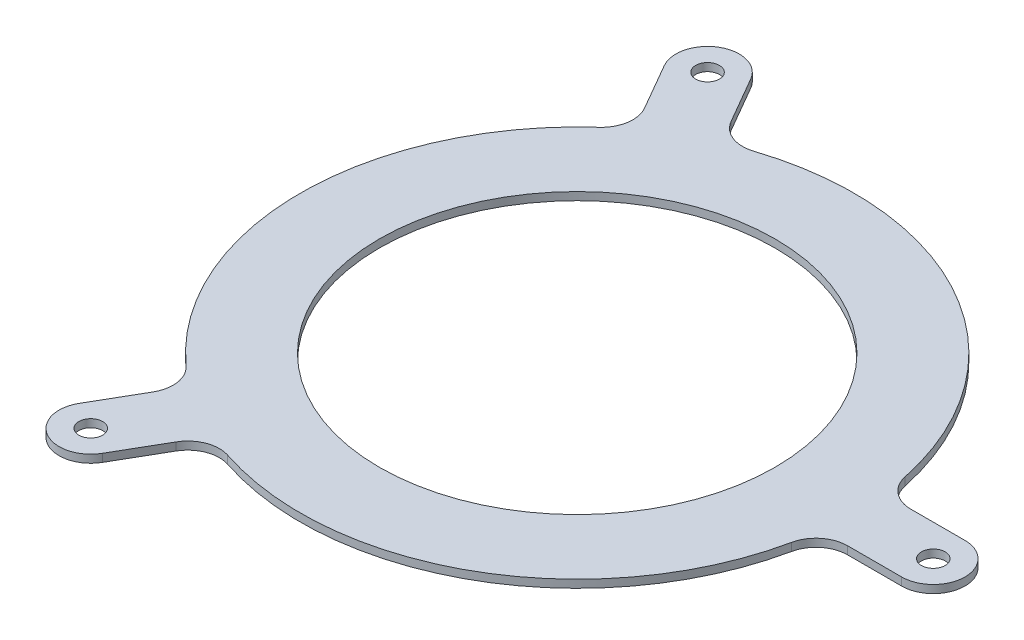
ISO-10303-21;
HEADER;
FILE_DESCRIPTION(('STEP AP214'),'2;1');
FILE_NAME('part.step','',(''),(''),'','','');
FILE_SCHEMA(('AUTOMOTIVE_DESIGN { 1 0 10303 214 1 1 1 1 }'));
ENDSEC;
DATA;
#1=APPLICATION_CONTEXT('core data for automotive mechanical design processes');
#2=APPLICATION_PROTOCOL_DEFINITION('international standard','automotive_design',2000,#1);
#3=PRODUCT_CONTEXT('',#1,'mechanical');
#4=PRODUCT('Part','Part','',(#3));
#5=PRODUCT_RELATED_PRODUCT_CATEGORY('part','',(#4));
#6=PRODUCT_DEFINITION_FORMATION('','',#4);
#7=PRODUCT_DEFINITION_CONTEXT('part definition',#1,'design');
#8=PRODUCT_DEFINITION('design','',#6,#7);
#9=PRODUCT_DEFINITION_SHAPE('','',#8);
#10=(LENGTH_UNIT() NAMED_UNIT(*) SI_UNIT(.MILLI.,.METRE.));
#11=(NAMED_UNIT(*) PLANE_ANGLE_UNIT() SI_UNIT($,.RADIAN.));
#12=(NAMED_UNIT(*) SI_UNIT($,.STERADIAN.) SOLID_ANGLE_UNIT());
#13=UNCERTAINTY_MEASURE_WITH_UNIT(LENGTH_MEASURE(1.E-05),#10,'distance_accuracy_value','');
#14=(GEOMETRIC_REPRESENTATION_CONTEXT(3) GLOBAL_UNCERTAINTY_ASSIGNED_CONTEXT((#13)) GLOBAL_UNIT_ASSIGNED_CONTEXT((#10,
#11,#12)) REPRESENTATION_CONTEXT('',''));
#15=CARTESIAN_POINT('',(0.,0.,0.));
#16=DIRECTION('',(0.,0.,1.));
#17=DIRECTION('',(1.,0.,0.));
#18=AXIS2_PLACEMENT_3D('',#15,#16,#17);
#19=CARTESIAN_POINT('',(0.,1.,0.));
#20=DIRECTION('',(0.,-1.,0.));
#21=DIRECTION('',(0.,0.,-1.));
#22=AXIS2_PLACEMENT_3D('',#19,#20,#21);
#23=CYLINDRICAL_SURFACE('',#22,35.);
#24=CARTESIAN_POINT('',(0.,0.,0.));
#25=DIRECTION('',(0.,1.,0.));
#26=DIRECTION('',(0.,0.,1.));
#27=AXIS2_PLACEMENT_3D('',#24,#25,#26);
#28=CIRCLE('',#27,35.);
#29=CARTESIAN_POINT('',(-10.9102461764105,0.,33.2560750596056));
#30=VERTEX_POINT('',#29);
#31=CARTESIAN_POINT('',(34.2557289199862,0.,7.17948717948719));
#32=VERTEX_POINT('',#31);
#33=EDGE_CURVE('E223',#30,#32,#28,.T.);
#34=ORIENTED_EDGE('',*,*,#33,.T.);
#35=DIRECTION('',(0.,-1.,0.));
#36=VECTOR('',#35,1.);
#37=CARTESIAN_POINT('',(34.2557289199862,1.,7.17948717948719));
#38=LINE('',#37,#36);
#39=CARTESIAN_POINT('',(34.2557289199862,1.,7.17948717948719));
#40=VERTEX_POINT('',#39);
#41=EDGE_CURVE('E290',#32,#40,#38,.F.);
#42=ORIENTED_EDGE('',*,*,#41,.T.);
#43=CARTESIAN_POINT('',(0.,1.,0.));
#44=DIRECTION('',(0.,1.,0.));
#45=DIRECTION('',(0.,0.,1.));
#46=AXIS2_PLACEMENT_3D('',#43,#44,#45);
#47=CIRCLE('',#46,35.);
#48=CARTESIAN_POINT('',(-10.9102461764105,1.,33.2560750596056));
#49=VERTEX_POINT('',#48);
#50=EDGE_CURVE('E182',#49,#40,#47,.T.);
#51=ORIENTED_EDGE('',*,*,#50,.F.);
#52=DIRECTION('',(0.,-1.,0.));
#53=VECTOR('',#52,1.);
#54=CARTESIAN_POINT('',(-10.9102461764105,1.,33.2560750596056));
#55=LINE('',#54,#53);
#56=EDGE_CURVE('E287',#49,#30,#55,.T.);
#57=ORIENTED_EDGE('',*,*,#56,.T.);
#58=EDGE_LOOP('',(#34,#42,#51,#57));
#59=FACE_BOUND('',#58,.T.);
#60=ADVANCED_FACE('F33',(#59),#23,.T.);
#61=CARTESIAN_POINT('',(0.,1.,4.00000000000001));
#62=DIRECTION('',(0.,0.,1.));
#63=DIRECTION('',(1.,0.,0.));
#64=AXIS2_PLACEMENT_3D('',#61,#62,#63);
#65=PLANE('',#64);
#66=DIRECTION('',(-1.,0.,0.));
#67=VECTOR('',#66,1.);
#68=CARTESIAN_POINT('',(0.,1.,4.00000000000001));
#69=LINE('',#68,#67);
#70=CARTESIAN_POINT('',(45.,1.,4.00000000000001));
#71=VERTEX_POINT('',#70);
#72=CARTESIAN_POINT('',(38.1706693679846,1.,4.00000000000001));
#73=VERTEX_POINT('',#72);
#74=EDGE_CURVE('E162',#71,#73,#69,.T.);
#75=ORIENTED_EDGE('',*,*,#74,.T.);
#76=DIRECTION('',(0.,-1.,0.));
#77=VECTOR('',#76,1.);
#78=CARTESIAN_POINT('',(38.1706693679846,1.,4.00000000000001));
#79=LINE('',#78,#77);
#80=CARTESIAN_POINT('',(38.1706693679846,0.,4.00000000000001));
#81=VERTEX_POINT('',#80);
#82=EDGE_CURVE('E285',#73,#81,#79,.T.);
#83=ORIENTED_EDGE('',*,*,#82,.T.);
#84=DIRECTION('',(-1.,0.,0.));
#85=VECTOR('',#84,1.);
#86=CARTESIAN_POINT('',(0.,0.,4.00000000000001));
#87=LINE('',#86,#85);
#88=CARTESIAN_POINT('',(45.,0.,4.00000000000001));
#89=VERTEX_POINT('',#88);
#90=EDGE_CURVE('E165',#89,#81,#87,.T.);
#91=ORIENTED_EDGE('',*,*,#90,.F.);
#92=DIRECTION('',(0.,-1.,0.));
#93=VECTOR('',#92,1.);
#94=CARTESIAN_POINT('',(45.,1.,4.00000000000001));
#95=LINE('',#94,#93);
#96=EDGE_CURVE('E158',#71,#89,#95,.T.);
#97=ORIENTED_EDGE('',*,*,#96,.F.);
#98=EDGE_LOOP('',(#75,#83,#91,#97));
#99=FACE_BOUND('',#98,.T.);
#100=ADVANCED_FACE('F160',(#99),#65,.T.);
#101=CARTESIAN_POINT('',(45.,1.,0.));
#102=DIRECTION('',(0.,-1.,0.));
#103=DIRECTION('',(0.,0.,-1.));
#104=AXIS2_PLACEMENT_3D('',#101,#102,#103);
#105=CYLINDRICAL_SURFACE('',#104,4.00000000000001);
#106=CARTESIAN_POINT('',(45.,0.,0.));
#107=DIRECTION('',(0.,1.,0.));
#108=DIRECTION('',(0.,0.,1.));
#109=AXIS2_PLACEMENT_3D('',#106,#107,#108);
#110=CIRCLE('',#109,4.00000000000001);
#111=CARTESIAN_POINT('',(45.,0.,-4.00000000000001));
#112=VERTEX_POINT('',#111);
#113=EDGE_CURVE('E229',#112,#89,#110,.F.);
#114=ORIENTED_EDGE('',*,*,#113,.F.);
#115=DIRECTION('',(0.,-1.,0.));
#116=VECTOR('',#115,1.);
#117=CARTESIAN_POINT('',(45.,1.,-4.00000000000001));
#118=LINE('',#117,#116);
#119=CARTESIAN_POINT('',(45.,1.,-4.00000000000001));
#120=VERTEX_POINT('',#119);
#121=EDGE_CURVE('E171',#120,#112,#118,.T.);
#122=ORIENTED_EDGE('',*,*,#121,.F.);
#123=CARTESIAN_POINT('',(45.,1.,0.));
#124=DIRECTION('',(0.,1.,0.));
#125=DIRECTION('',(0.,0.,1.));
#126=AXIS2_PLACEMENT_3D('',#123,#124,#125);
#127=CIRCLE('',#126,4.00000000000001);
#128=EDGE_CURVE('E178',#120,#71,#127,.F.);
#129=ORIENTED_EDGE('',*,*,#128,.T.);
#130=ORIENTED_EDGE('',*,*,#96,.T.);
#131=EDGE_LOOP('',(#114,#122,#129,#130));
#132=FACE_BOUND('',#131,.T.);
#133=ADVANCED_FACE('F184',(#132),#105,.T.);
#134=CARTESIAN_POINT('',(0.,1.,-4.00000000000001));
#135=DIRECTION('',(0.,0.,1.));
#136=DIRECTION('',(1.,0.,0.));
#137=AXIS2_PLACEMENT_3D('',#134,#135,#136);
#138=PLANE('',#137);
#139=DIRECTION('',(-1.,0.,0.));
#140=VECTOR('',#139,1.);
#141=CARTESIAN_POINT('',(0.,0.,-4.00000000000001));
#142=LINE('',#141,#140);
#143=CARTESIAN_POINT('',(38.1706693679846,0.,-4.00000000000001));
#144=VERTEX_POINT('',#143);
#145=EDGE_CURVE('E231',#112,#144,#142,.T.);
#146=ORIENTED_EDGE('',*,*,#145,.T.);
#147=DIRECTION('',(0.,1.,0.));
#148=VECTOR('',#147,1.);
#149=CARTESIAN_POINT('',(38.1706693679846,1.,-4.00000000000001));
#150=LINE('',#149,#148);
#151=CARTESIAN_POINT('',(38.1706693679846,1.,-4.00000000000001));
#152=VERTEX_POINT('',#151);
#153=EDGE_CURVE('E283',#144,#152,#150,.T.);
#154=ORIENTED_EDGE('',*,*,#153,.T.);
#155=DIRECTION('',(-1.,0.,0.));
#156=VECTOR('',#155,1.);
#157=CARTESIAN_POINT('',(0.,1.,-4.00000000000001));
#158=LINE('',#157,#156);
#159=EDGE_CURVE('E186',#120,#152,#158,.T.);
#160=ORIENTED_EDGE('',*,*,#159,.F.);
#161=ORIENTED_EDGE('',*,*,#121,.T.);
#162=EDGE_LOOP('',(#146,#154,#160,#161));
#163=FACE_BOUND('',#162,.T.);
#164=ADVANCED_FACE('F377',(#163),#138,.F.);
#165=CARTESIAN_POINT('',(34.2557289199862,0.,-7.17948717948719));
#166=VERTEX_POINT('',#165);
#167=CARTESIAN_POINT('',(-10.9102461764143,0.,-33.2560750596043));
#168=VERTEX_POINT('',#167);
#169=EDGE_CURVE('E226',#166,#168,#28,.T.);
#170=ORIENTED_EDGE('',*,*,#169,.T.);
#171=DIRECTION('',(0.,-1.,0.));
#172=VECTOR('',#171,1.);
#173=CARTESIAN_POINT('',(-10.9102461764143,1.,-33.2560750596043));
#174=LINE('',#173,#172);
#175=CARTESIAN_POINT('',(-10.9102461764143,1.,-33.2560750596043));
#176=VERTEX_POINT('',#175);
#177=EDGE_CURVE('E281',#168,#176,#174,.F.);
#178=ORIENTED_EDGE('',*,*,#177,.T.);
#179=CARTESIAN_POINT('',(34.2557289199862,1.,-7.17948717948719));
#180=VERTEX_POINT('',#179);
#181=EDGE_CURVE('E188',#180,#176,#47,.T.);
#182=ORIENTED_EDGE('',*,*,#181,.F.);
#183=DIRECTION('',(0.,-1.,0.));
#184=VECTOR('',#183,1.);
#185=CARTESIAN_POINT('',(34.2557289199862,1.,-7.17948717948719));
#186=LINE('',#185,#184);
#187=EDGE_CURVE('E278',#180,#166,#186,.T.);
#188=ORIENTED_EDGE('',*,*,#187,.T.);
#189=EDGE_LOOP('',(#170,#178,#182,#188));
#190=FACE_BOUND('',#189,.T.);
#191=ADVANCED_FACE('F337',(#190),#23,.T.);
#192=CARTESIAN_POINT('',(3.46410161513598,1.,-1.99999999999898));
#193=DIRECTION('',(0.866025403784438,0.,-0.500000000000001));
#194=DIRECTION('',(-0.500000000000001,0.,-0.866025403784438));
#195=AXIS2_PLACEMENT_3D('',#192,#193,#194);
#196=PLANE('',#195);
#197=DIRECTION('',(0.500000000000001,0.,0.866025403784438));
#198=VECTOR('',#197,1.);
#199=CARTESIAN_POINT('',(3.46410161513598,1.,-1.99999999999898));
#200=LINE('',#199,#198);
#201=CARTESIAN_POINT('',(-19.0358983848633,1.,-40.9711431702974));
#202=VERTEX_POINT('',#201);
#203=CARTESIAN_POINT('',(-15.6212330688566,1.,-35.0567693521305));
#204=VERTEX_POINT('',#203);
#205=EDGE_CURVE('E192',#202,#204,#200,.T.);
#206=ORIENTED_EDGE('',*,*,#205,.T.);
#207=DIRECTION('',(0.,-1.,0.));
#208=VECTOR('',#207,1.);
#209=CARTESIAN_POINT('',(-15.6212330688566,1.,-35.0567693521305));
#210=LINE('',#209,#208);
#211=CARTESIAN_POINT('',(-15.6212330688566,0.,-35.0567693521305));
#212=VERTEX_POINT('',#211);
#213=EDGE_CURVE('E275',#204,#212,#210,.T.);
#214=ORIENTED_EDGE('',*,*,#213,.T.);
#215=DIRECTION('',(0.500000000000001,0.,0.866025403784438));
#216=VECTOR('',#215,1.);
#217=CARTESIAN_POINT('',(3.46410161513598,0.,-1.99999999999898));
#218=LINE('',#217,#216);
#219=CARTESIAN_POINT('',(-19.0358983848633,0.,-40.9711431702974));
#220=VERTEX_POINT('',#219);
#221=EDGE_CURVE('E234',#220,#212,#218,.T.);
#222=ORIENTED_EDGE('',*,*,#221,.F.);
#223=DIRECTION('',(0.,-1.,0.));
#224=VECTOR('',#223,1.);
#225=CARTESIAN_POINT('',(-19.0358983848633,1.,-40.9711431702974));
#226=LINE('',#225,#224);
#227=EDGE_CURVE('E266',#202,#220,#226,.T.);
#228=ORIENTED_EDGE('',*,*,#227,.F.);
#229=EDGE_LOOP('',(#206,#214,#222,#228));
#230=FACE_BOUND('',#229,.T.);
#231=ADVANCED_FACE('F348',(#230),#196,.T.);
#232=CARTESIAN_POINT('',(-22.500000000001,1.,-38.9711431702974));
#233=DIRECTION('',(0.,-1.,0.));
#234=DIRECTION('',(0.,0.,-1.));
#235=AXIS2_PLACEMENT_3D('',#232,#233,#234);
#236=CYLINDRICAL_SURFACE('',#235,4.);
#237=CARTESIAN_POINT('',(-22.500000000001,0.,-38.9711431702974));
#238=DIRECTION('',(0.,1.,0.));
#239=DIRECTION('',(0.,0.,1.));
#240=AXIS2_PLACEMENT_3D('',#237,#238,#239);
#241=CIRCLE('',#240,4.);
#242=CARTESIAN_POINT('',(-25.9641016151388,0.,-36.9711431702974));
#243=VERTEX_POINT('',#242);
#244=EDGE_CURVE('E237',#243,#220,#241,.F.);
#245=ORIENTED_EDGE('',*,*,#244,.F.);
#246=DIRECTION('',(0.,-1.,0.));
#247=VECTOR('',#246,1.);
#248=CARTESIAN_POINT('',(-25.9641016151388,1.,-36.9711431702974));
#249=LINE('',#248,#247);
#250=CARTESIAN_POINT('',(-25.9641016151388,1.,-36.9711431702974));
#251=VERTEX_POINT('',#250);
#252=EDGE_CURVE('E264',#251,#243,#249,.T.);
#253=ORIENTED_EDGE('',*,*,#252,.F.);
#254=CARTESIAN_POINT('',(-22.500000000001,1.,-38.9711431702974));
#255=DIRECTION('',(0.,1.,0.));
#256=DIRECTION('',(0.,0.,1.));
#257=AXIS2_PLACEMENT_3D('',#254,#255,#256);
#258=CIRCLE('',#257,4.);
#259=EDGE_CURVE('E195',#251,#202,#258,.F.);
#260=ORIENTED_EDGE('',*,*,#259,.T.);
#261=ORIENTED_EDGE('',*,*,#227,.T.);
#262=EDGE_LOOP('',(#245,#253,#260,#261));
#263=FACE_BOUND('',#262,.T.);
#264=ADVANCED_FACE('F352',(#263),#236,.T.);
#265=CARTESIAN_POINT('',(-3.46410161513956,1.,2.00000000000104));
#266=DIRECTION('',(0.866025403784439,0.,-0.5));
#267=DIRECTION('',(-0.5,0.,-0.866025403784439));
#268=AXIS2_PLACEMENT_3D('',#265,#266,#267);
#269=PLANE('',#268);
#270=DIRECTION('',(0.5,0.,0.866025403784439));
#271=VECTOR('',#270,1.);
#272=CARTESIAN_POINT('',(-3.46410161513956,0.,2.00000000000104));
#273=LINE('',#272,#271);
#274=CARTESIAN_POINT('',(-22.5494362991317,0.,-31.0567693521298));
#275=VERTEX_POINT('',#274);
#276=EDGE_CURVE('E240',#243,#275,#273,.T.);
#277=ORIENTED_EDGE('',*,*,#276,.T.);
#278=DIRECTION('',(0.,1.,0.));
#279=VECTOR('',#278,1.);
#280=CARTESIAN_POINT('',(-22.5494362991317,1.,-31.0567693521298));
#281=LINE('',#280,#279);
#282=CARTESIAN_POINT('',(-22.5494362991317,1.,-31.0567693521298));
#283=VERTEX_POINT('',#282);
#284=EDGE_CURVE('E273',#275,#283,#281,.T.);
#285=ORIENTED_EDGE('',*,*,#284,.T.);
#286=DIRECTION('',(0.5,0.,0.866025403784439));
#287=VECTOR('',#286,1.);
#288=CARTESIAN_POINT('',(-3.46410161513956,1.,2.00000000000104));
#289=LINE('',#288,#287);
#290=EDGE_CURVE('E198',#251,#283,#289,.T.);
#291=ORIENTED_EDGE('',*,*,#290,.F.);
#292=ORIENTED_EDGE('',*,*,#252,.T.);
#293=EDGE_LOOP('',(#277,#285,#291,#292));
#294=FACE_BOUND('',#293,.T.);
#295=ADVANCED_FACE('F360',(#294),#269,.F.);
#296=CARTESIAN_POINT('',(-23.3454827435751,1.,-26.0765878801165));
#297=VERTEX_POINT('',#296);
#298=CARTESIAN_POINT('',(-23.3454827435721,1.,26.0765878801192));
#299=VERTEX_POINT('',#298);
#300=EDGE_CURVE('E201',#297,#299,#47,.T.);
#301=ORIENTED_EDGE('',*,*,#300,.F.);
#302=DIRECTION('',(0.,-1.,0.));
#303=VECTOR('',#302,1.);
#304=CARTESIAN_POINT('',(-23.3454827435751,1.,-26.0765878801165));
#305=LINE('',#304,#303);
#306=CARTESIAN_POINT('',(-23.3454827435751,0.,-26.0765878801165));
#307=VERTEX_POINT('',#306);
#308=EDGE_CURVE('E270',#297,#307,#305,.T.);
#309=ORIENTED_EDGE('',*,*,#308,.T.);
#310=CARTESIAN_POINT('',(-23.3454827435721,0.,26.0765878801192));
#311=VERTEX_POINT('',#310);
#312=EDGE_CURVE('E227',#307,#311,#28,.T.);
#313=ORIENTED_EDGE('',*,*,#312,.T.);
#314=DIRECTION('',(0.,-1.,0.));
#315=VECTOR('',#314,1.);
#316=CARTESIAN_POINT('',(-23.3454827435721,1.,26.0765878801192));
#317=LINE('',#316,#315);
#318=EDGE_CURVE('E170',#311,#299,#317,.F.);
#319=ORIENTED_EDGE('',*,*,#318,.T.);
#320=EDGE_LOOP('',(#301,#309,#313,#319));
#321=FACE_BOUND('',#320,.T.);
#322=ADVANCED_FACE('F331',(#321),#23,.T.);
#323=CARTESIAN_POINT('',(-3.46410161513573,1.,-1.99999999999883));
#324=DIRECTION('',(-0.866025403784439,0.,-0.5));
#325=DIRECTION('',(-0.5,0.,0.866025403784439));
#326=AXIS2_PLACEMENT_3D('',#323,#324,#325);
#327=PLANE('',#326);
#328=DIRECTION('',(0.5,0.,-0.866025403784439));
#329=VECTOR('',#328,1.);
#330=CARTESIAN_POINT('',(-3.46410161513573,1.,-1.99999999999883));
#331=LINE('',#330,#329);
#332=CARTESIAN_POINT('',(-25.9641016151362,1.,36.9711431703018));
#333=VERTEX_POINT('',#332);
#334=CARTESIAN_POINT('',(-22.5494362991283,1.,31.0567693521328));
#335=VERTEX_POINT('',#334);
#336=EDGE_CURVE('E202',#333,#335,#331,.T.);
#337=ORIENTED_EDGE('',*,*,#336,.T.);
#338=DIRECTION('',(0.,-1.,0.));
#339=VECTOR('',#338,1.);
#340=CARTESIAN_POINT('',(-22.5494362991283,1.,31.0567693521328));
#341=LINE('',#340,#339);
#342=CARTESIAN_POINT('',(-22.5494362991283,0.,31.0567693521328));
#343=VERTEX_POINT('',#342);
#344=EDGE_CURVE('E292',#335,#343,#341,.T.);
#345=ORIENTED_EDGE('',*,*,#344,.T.);
#346=DIRECTION('',(0.5,0.,-0.866025403784439));
#347=VECTOR('',#346,1.);
#348=CARTESIAN_POINT('',(-3.46410161513573,0.,-1.99999999999883));
#349=LINE('',#348,#347);
#350=CARTESIAN_POINT('',(-25.9641016151362,0.,36.9711431703018));
#351=VERTEX_POINT('',#350);
#352=EDGE_CURVE('E243',#351,#343,#349,.T.);
#353=ORIENTED_EDGE('',*,*,#352,.F.);
#354=DIRECTION('',(0.,-1.,0.));
#355=VECTOR('',#354,1.);
#356=CARTESIAN_POINT('',(-25.9641016151362,1.,36.9711431703018));
#357=LINE('',#356,#355);
#358=EDGE_CURVE('E262',#333,#351,#357,.T.);
#359=ORIENTED_EDGE('',*,*,#358,.F.);
#360=EDGE_LOOP('',(#337,#345,#353,#359));
#361=FACE_BOUND('',#360,.T.);
#362=ADVANCED_FACE('F323',(#361),#327,.T.);
#363=CARTESIAN_POINT('',(-22.4999999999985,1.,38.9711431703018));
#364=DIRECTION('',(0.,-1.,0.));
#365=DIRECTION('',(0.,0.,-1.));
#366=AXIS2_PLACEMENT_3D('',#363,#364,#365);
#367=CYLINDRICAL_SURFACE('',#366,4.);
#368=CARTESIAN_POINT('',(-22.4999999999985,0.,38.9711431703018));
#369=DIRECTION('',(0.,1.,0.));
#370=DIRECTION('',(0.,0.,1.));
#371=AXIS2_PLACEMENT_3D('',#368,#369,#370);
#372=CIRCLE('',#371,4.);
#373=CARTESIAN_POINT('',(-19.0358983848607,0.,40.9711431703018));
#374=VERTEX_POINT('',#373);
#375=EDGE_CURVE('E246',#374,#351,#372,.F.);
#376=ORIENTED_EDGE('',*,*,#375,.F.);
#377=DIRECTION('',(0.,-1.,0.));
#378=VECTOR('',#377,1.);
#379=CARTESIAN_POINT('',(-19.0358983848607,1.,40.9711431703018));
#380=LINE('',#379,#378);
#381=CARTESIAN_POINT('',(-19.0358983848607,1.,40.9711431703018));
#382=VERTEX_POINT('',#381);
#383=EDGE_CURVE('E219',#382,#374,#380,.T.);
#384=ORIENTED_EDGE('',*,*,#383,.F.);
#385=CARTESIAN_POINT('',(-22.4999999999985,1.,38.9711431703018));
#386=DIRECTION('',(0.,1.,0.));
#387=DIRECTION('',(0.,0.,1.));
#388=AXIS2_PLACEMENT_3D('',#385,#386,#387);
#389=CIRCLE('',#388,4.);
#390=EDGE_CURVE('E205',#382,#333,#389,.F.);
#391=ORIENTED_EDGE('',*,*,#390,.T.);
#392=ORIENTED_EDGE('',*,*,#358,.T.);
#393=EDGE_LOOP('',(#376,#384,#391,#392));
#394=FACE_BOUND('',#393,.T.);
#395=ADVANCED_FACE('F438',(#394),#367,.T.);
#396=CARTESIAN_POINT('',(-22.500000000001,1.,-38.9711431702974));
#397=DIRECTION('',(0.,-1.,0.));
#398=DIRECTION('',(0.,0.,-1.));
#399=AXIS2_PLACEMENT_3D('',#396,#397,#398);
#400=CYLINDRICAL_SURFACE('',#399,1.50000000000071);
#401=CARTESIAN_POINT('',(-22.500000000001,1.,-38.9711431702974));
#402=DIRECTION('',(0.,1.,0.));
#403=DIRECTION('',(0.,0.,1.));
#404=AXIS2_PLACEMENT_3D('',#401,#402,#403);
#405=CIRCLE('',#404,1.50000000000071);
#406=CARTESIAN_POINT('',(-22.500000000001,1.,-37.4711431702967));
#407=VERTEX_POINT('',#406);
#408=EDGE_CURVE('E213',#407,#407,#405,.T.);
#409=ORIENTED_EDGE('',*,*,#408,.T.);
#410=EDGE_LOOP('',(#409));
#411=FACE_BOUND('',#410,.T.);
#412=CARTESIAN_POINT('',(-22.500000000001,0.,-38.9711431702974));
#413=DIRECTION('',(0.,1.,0.));
#414=DIRECTION('',(0.,0.,1.));
#415=AXIS2_PLACEMENT_3D('',#412,#413,#414);
#416=CIRCLE('',#415,1.50000000000071);
#417=CARTESIAN_POINT('',(-22.500000000001,0.,-37.4711431702967));
#418=VERTEX_POINT('',#417);
#419=EDGE_CURVE('E254',#418,#418,#416,.T.);
#420=ORIENTED_EDGE('',*,*,#419,.F.);
#421=EDGE_LOOP('',(#420));
#422=FACE_BOUND('',#421,.T.);
#423=ADVANCED_FACE('F434',(#411,#422),#400,.F.);
#424=CARTESIAN_POINT('',(-22.5000000000002,1.,38.9711431702996));
#425=DIRECTION('',(0.,-1.,0.));
#426=DIRECTION('',(0.,0.,-1.));
#427=AXIS2_PLACEMENT_3D('',#424,#425,#426);
#428=CYLINDRICAL_SURFACE('',#427,1.50000000000001);
#429=CARTESIAN_POINT('',(-22.5000000000002,1.,38.9711431702996));
#430=DIRECTION('',(0.,1.,0.));
#431=DIRECTION('',(0.,0.,1.));
#432=AXIS2_PLACEMENT_3D('',#429,#430,#431);
#433=CIRCLE('',#432,1.50000000000001);
#434=CARTESIAN_POINT('',(-22.5000000000002,1.,40.4711431702996));
#435=VERTEX_POINT('',#434);
#436=EDGE_CURVE('E210',#435,#435,#433,.T.);
#437=ORIENTED_EDGE('',*,*,#436,.T.);
#438=EDGE_LOOP('',(#437));
#439=FACE_BOUND('',#438,.T.);
#440=CARTESIAN_POINT('',(-22.5000000000002,0.,38.9711431702996));
#441=DIRECTION('',(0.,1.,0.));
#442=DIRECTION('',(0.,0.,1.));
#443=AXIS2_PLACEMENT_3D('',#440,#441,#442);
#444=CIRCLE('',#443,1.50000000000001);
#445=CARTESIAN_POINT('',(-22.5000000000002,0.,40.4711431702996));
#446=VERTEX_POINT('',#445);
#447=EDGE_CURVE('E251',#446,#446,#444,.T.);
#448=ORIENTED_EDGE('',*,*,#447,.F.);
#449=EDGE_LOOP('',(#448));
#450=FACE_BOUND('',#449,.T.);
#451=ADVANCED_FACE('F437',(#439,#450),#428,.F.);
#452=CARTESIAN_POINT('',(3.46410161513978,1.,2.00000000000117));
#453=DIRECTION('',(-0.866025403784439,0.,-0.5));
#454=DIRECTION('',(-0.5,0.,0.866025403784439));
#455=AXIS2_PLACEMENT_3D('',#452,#453,#454);
#456=PLANE('',#455);
#457=DIRECTION('',(0.5,0.,-0.866025403784439));
#458=VECTOR('',#457,1.);
#459=CARTESIAN_POINT('',(3.46410161513978,0.,2.00000000000117));
#460=LINE('',#459,#458);
#461=CARTESIAN_POINT('',(-15.6212330688523,0.,35.056769352132));
#462=VERTEX_POINT('',#461);
#463=EDGE_CURVE('E249',#374,#462,#460,.T.);
#464=ORIENTED_EDGE('',*,*,#463,.T.);
#465=DIRECTION('',(0.,1.,0.));
#466=VECTOR('',#465,1.);
#467=CARTESIAN_POINT('',(-15.6212330688523,1.,35.056769352132));
#468=LINE('',#467,#466);
#469=CARTESIAN_POINT('',(-15.6212330688523,1.,35.056769352132));
#470=VERTEX_POINT('',#469);
#471=EDGE_CURVE('E48',#462,#470,#468,.T.);
#472=ORIENTED_EDGE('',*,*,#471,.T.);
#473=DIRECTION('',(0.5,0.,-0.866025403784439));
#474=VECTOR('',#473,1.);
#475=CARTESIAN_POINT('',(3.46410161513978,1.,2.00000000000117));
#476=LINE('',#475,#474);
#477=EDGE_CURVE('E208',#382,#470,#476,.T.);
#478=ORIENTED_EDGE('',*,*,#477,.F.);
#479=ORIENTED_EDGE('',*,*,#383,.T.);
#480=EDGE_LOOP('',(#464,#472,#478,#479));
#481=FACE_BOUND('',#480,.T.);
#482=ADVANCED_FACE('F394',(#481),#456,.F.);
#483=CARTESIAN_POINT('',(0.,1.,0.));
#484=DIRECTION('',(0.,-1.,0.));
#485=DIRECTION('',(0.,0.,-1.));
#486=AXIS2_PLACEMENT_3D('',#483,#484,#485);
#487=CYLINDRICAL_SURFACE('',#486,25.);
#488=CARTESIAN_POINT('',(0.,1.,0.));
#489=DIRECTION('',(0.,1.,0.));
#490=DIRECTION('',(0.,0.,1.));
#491=AXIS2_PLACEMENT_3D('',#488,#489,#490);
#492=CIRCLE('',#491,25.);
#493=CARTESIAN_POINT('',(0.,1.,25.));
#494=VERTEX_POINT('',#493);
#495=EDGE_CURVE('E260',#494,#494,#492,.T.);
#496=ORIENTED_EDGE('',*,*,#495,.T.);
#497=EDGE_LOOP('',(#496));
#498=FACE_BOUND('',#497,.T.);
#499=CARTESIAN_POINT('',(0.,0.,0.));
#500=DIRECTION('',(0.,1.,0.));
#501=DIRECTION('',(0.,0.,1.));
#502=AXIS2_PLACEMENT_3D('',#499,#500,#501);
#503=CIRCLE('',#502,25.);
#504=CARTESIAN_POINT('',(0.,0.,25.));
#505=VERTEX_POINT('',#504);
#506=EDGE_CURVE('E220',#505,#505,#503,.T.);
#507=ORIENTED_EDGE('',*,*,#506,.F.);
#508=EDGE_LOOP('',(#507));
#509=FACE_BOUND('',#508,.T.);
#510=ADVANCED_FACE('F390',(#498,#509),#487,.F.);
#511=CARTESIAN_POINT('',(45.,1.,0.));
#512=DIRECTION('',(0.,-1.,0.));
#513=DIRECTION('',(0.,0.,-1.));
#514=AXIS2_PLACEMENT_3D('',#511,#512,#513);
#515=CYLINDRICAL_SURFACE('',#514,1.5);
#516=CARTESIAN_POINT('',(45.,1.,0.));
#517=DIRECTION('',(0.,1.,0.));
#518=DIRECTION('',(0.,0.,1.));
#519=AXIS2_PLACEMENT_3D('',#516,#517,#518);
#520=CIRCLE('',#519,1.5);
#521=CARTESIAN_POINT('',(45.,1.,1.5));
#522=VERTEX_POINT('',#521);
#523=EDGE_CURVE('E216',#522,#522,#520,.T.);
#524=ORIENTED_EDGE('',*,*,#523,.T.);
#525=EDGE_LOOP('',(#524));
#526=FACE_BOUND('',#525,.T.);
#527=CARTESIAN_POINT('',(45.,0.,0.));
#528=DIRECTION('',(0.,1.,0.));
#529=DIRECTION('',(0.,0.,1.));
#530=AXIS2_PLACEMENT_3D('',#527,#528,#529);
#531=CIRCLE('',#530,1.5);
#532=CARTESIAN_POINT('',(45.,0.,1.5));
#533=VERTEX_POINT('',#532);
#534=EDGE_CURVE('E257',#533,#533,#531,.T.);
#535=ORIENTED_EDGE('',*,*,#534,.F.);
#536=EDGE_LOOP('',(#535));
#537=FACE_BOUND('',#536,.T.);
#538=ADVANCED_FACE('F393',(#526,#537),#515,.F.);
#539=CARTESIAN_POINT('',(0.,1.,0.));
#540=DIRECTION('',(0.,1.,0.));
#541=DIRECTION('',(0.,0.,1.));
#542=AXIS2_PLACEMENT_3D('',#539,#540,#541);
#543=PLANE('',#542);
#544=ORIENTED_EDGE('',*,*,#495,.F.);
#545=EDGE_LOOP('',(#544));
#546=FACE_BOUND('',#545,.T.);
#547=ORIENTED_EDGE('',*,*,#477,.T.);
#548=CARTESIAN_POINT('',(-12.1571314537145,1.,37.056769352132));
#549=DIRECTION('',(0.,1.,0.));
#550=DIRECTION('',(0.,0.,1.));
#551=AXIS2_PLACEMENT_3D('',#548,#549,#550);
#552=CIRCLE('',#551,4.);
#553=EDGE_CURVE('E11',#470,#49,#552,.F.);
#554=ORIENTED_EDGE('',*,*,#553,.T.);
#555=ORIENTED_EDGE('',*,*,#50,.T.);
#556=CARTESIAN_POINT('',(38.1706693679846,1.,8.00000000000001));
#557=DIRECTION('',(0.,1.,0.));
#558=DIRECTION('',(0.,0.,1.));
#559=AXIS2_PLACEMENT_3D('',#556,#557,#558);
#560=CIRCLE('',#559,4.);
#561=EDGE_CURVE('E181',#40,#73,#560,.F.);
#562=ORIENTED_EDGE('',*,*,#561,.T.);
#563=ORIENTED_EDGE('',*,*,#74,.F.);
#564=ORIENTED_EDGE('',*,*,#128,.F.);
#565=ORIENTED_EDGE('',*,*,#159,.T.);
#566=CARTESIAN_POINT('',(38.1706693679846,1.,-8.00000000000001));
#567=DIRECTION('',(0.,1.,0.));
#568=DIRECTION('',(0.,0.,1.));
#569=AXIS2_PLACEMENT_3D('',#566,#567,#568);
#570=CIRCLE('',#569,4.);
#571=EDGE_CURVE('E306',#152,#180,#570,.F.);
#572=ORIENTED_EDGE('',*,*,#571,.T.);
#573=ORIENTED_EDGE('',*,*,#181,.T.);
#574=CARTESIAN_POINT('',(-12.1571314537188,1.,-37.0567693521305));
#575=DIRECTION('',(0.,1.,0.));
#576=DIRECTION('',(0.,0.,1.));
#577=AXIS2_PLACEMENT_3D('',#574,#575,#576);
#578=CIRCLE('',#577,4.);
#579=EDGE_CURVE('E302',#176,#204,#578,.F.);
#580=ORIENTED_EDGE('',*,*,#579,.T.);
#581=ORIENTED_EDGE('',*,*,#205,.F.);
#582=ORIENTED_EDGE('',*,*,#259,.F.);
#583=ORIENTED_EDGE('',*,*,#290,.T.);
#584=CARTESIAN_POINT('',(-26.0135379142694,1.,-29.0567693521298));
#585=DIRECTION('',(0.,1.,0.));
#586=DIRECTION('',(0.,0.,1.));
#587=AXIS2_PLACEMENT_3D('',#584,#585,#586);
#588=CIRCLE('',#587,4.);
#589=EDGE_CURVE('E298',#283,#297,#588,.F.);
#590=ORIENTED_EDGE('',*,*,#589,.T.);
#591=ORIENTED_EDGE('',*,*,#300,.T.);
#592=CARTESIAN_POINT('',(-26.013537914266,1.,29.0567693521328));
#593=DIRECTION('',(0.,1.,0.));
#594=DIRECTION('',(0.,0.,1.));
#595=AXIS2_PLACEMENT_3D('',#592,#593,#594);
#596=CIRCLE('',#595,4.);
#597=EDGE_CURVE('E313',#299,#335,#596,.F.);
#598=ORIENTED_EDGE('',*,*,#597,.T.);
#599=ORIENTED_EDGE('',*,*,#336,.F.);
#600=ORIENTED_EDGE('',*,*,#390,.F.);
#601=EDGE_LOOP('',(#547,#554,#555,#562,#563,#564,#565,#572,#573,#580,#581,#582,#583,#590,#591,
#598,#599,#600));
#602=FACE_BOUND('',#601,.T.);
#603=ORIENTED_EDGE('',*,*,#436,.F.);
#604=EDGE_LOOP('',(#603));
#605=FACE_BOUND('',#604,.T.);
#606=ORIENTED_EDGE('',*,*,#408,.F.);
#607=EDGE_LOOP('',(#606));
#608=FACE_BOUND('',#607,.T.);
#609=ORIENTED_EDGE('',*,*,#523,.F.);
#610=EDGE_LOOP('',(#609));
#611=FACE_BOUND('',#610,.T.);
#612=ADVANCED_FACE('F175',(#546,#602,#605,#608,#611),#543,.T.);
#613=CARTESIAN_POINT('',(0.,0.,0.));
#614=DIRECTION('',(0.,1.,0.));
#615=DIRECTION('',(0.,0.,1.));
#616=AXIS2_PLACEMENT_3D('',#613,#614,#615);
#617=PLANE('',#616);
#618=ORIENTED_EDGE('',*,*,#506,.T.);
#619=EDGE_LOOP('',(#618));
#620=FACE_BOUND('',#619,.T.);
#621=ORIENTED_EDGE('',*,*,#33,.F.);
#622=CARTESIAN_POINT('',(-12.1571314537145,0.,37.056769352132));
#623=DIRECTION('',(0.,1.,0.));
#624=DIRECTION('',(0.,0.,1.));
#625=AXIS2_PLACEMENT_3D('',#622,#623,#624);
#626=CIRCLE('',#625,4.);
#627=EDGE_CURVE('E41',#30,#462,#626,.T.);
#628=ORIENTED_EDGE('',*,*,#627,.T.);
#629=ORIENTED_EDGE('',*,*,#463,.F.);
#630=ORIENTED_EDGE('',*,*,#375,.T.);
#631=ORIENTED_EDGE('',*,*,#352,.T.);
#632=CARTESIAN_POINT('',(-26.013537914266,0.,29.0567693521328));
#633=DIRECTION('',(0.,1.,0.));
#634=DIRECTION('',(0.,0.,1.));
#635=AXIS2_PLACEMENT_3D('',#632,#633,#634);
#636=CIRCLE('',#635,4.);
#637=EDGE_CURVE('E311',#343,#311,#636,.T.);
#638=ORIENTED_EDGE('',*,*,#637,.T.);
#639=ORIENTED_EDGE('',*,*,#312,.F.);
#640=CARTESIAN_POINT('',(-26.0135379142694,0.,-29.0567693521298));
#641=DIRECTION('',(0.,1.,0.));
#642=DIRECTION('',(0.,0.,1.));
#643=AXIS2_PLACEMENT_3D('',#640,#641,#642);
#644=CIRCLE('',#643,4.);
#645=EDGE_CURVE('E296',#307,#275,#644,.T.);
#646=ORIENTED_EDGE('',*,*,#645,.T.);
#647=ORIENTED_EDGE('',*,*,#276,.F.);
#648=ORIENTED_EDGE('',*,*,#244,.T.);
#649=ORIENTED_EDGE('',*,*,#221,.T.);
#650=CARTESIAN_POINT('',(-12.1571314537188,0.,-37.0567693521305));
#651=DIRECTION('',(0.,1.,0.));
#652=DIRECTION('',(0.,0.,1.));
#653=AXIS2_PLACEMENT_3D('',#650,#651,#652);
#654=CIRCLE('',#653,4.);
#655=EDGE_CURVE('E300',#212,#168,#654,.T.);
#656=ORIENTED_EDGE('',*,*,#655,.T.);
#657=ORIENTED_EDGE('',*,*,#169,.F.);
#658=CARTESIAN_POINT('',(38.1706693679846,0.,-8.00000000000001));
#659=DIRECTION('',(0.,1.,0.));
#660=DIRECTION('',(0.,0.,1.));
#661=AXIS2_PLACEMENT_3D('',#658,#659,#660);
#662=CIRCLE('',#661,4.);
#663=EDGE_CURVE('E304',#166,#144,#662,.T.);
#664=ORIENTED_EDGE('',*,*,#663,.T.);
#665=ORIENTED_EDGE('',*,*,#145,.F.);
#666=ORIENTED_EDGE('',*,*,#113,.T.);
#667=ORIENTED_EDGE('',*,*,#90,.T.);
#668=CARTESIAN_POINT('',(38.1706693679846,0.,8.00000000000001));
#669=DIRECTION('',(0.,1.,0.));
#670=DIRECTION('',(0.,0.,1.));
#671=AXIS2_PLACEMENT_3D('',#668,#669,#670);
#672=CIRCLE('',#671,4.);
#673=EDGE_CURVE('E308',#81,#32,#672,.T.);
#674=ORIENTED_EDGE('',*,*,#673,.T.);
#675=EDGE_LOOP('',(#621,#628,#629,#630,#631,#638,#639,#646,#647,#648,#649,#656,#657,#664,#665,
#666,#667,#674));
#676=FACE_BOUND('',#675,.T.);
#677=ORIENTED_EDGE('',*,*,#447,.T.);
#678=EDGE_LOOP('',(#677));
#679=FACE_BOUND('',#678,.T.);
#680=ORIENTED_EDGE('',*,*,#419,.T.);
#681=EDGE_LOOP('',(#680));
#682=FACE_BOUND('',#681,.T.);
#683=ORIENTED_EDGE('',*,*,#534,.T.);
#684=EDGE_LOOP('',(#683));
#685=FACE_BOUND('',#684,.T.);
#686=ADVANCED_FACE('F328',(#620,#676,#679,#682,#685),#617,.F.);
#687=CARTESIAN_POINT('',(-26.0135379142694,1.,-29.0567693521298));
#688=DIRECTION('',(0.,-1.,0.));
#689=DIRECTION('',(0.,0.,-1.));
#690=AXIS2_PLACEMENT_3D('',#687,#688,#689);
#691=CYLINDRICAL_SURFACE('',#690,4.);
#692=ORIENTED_EDGE('',*,*,#589,.F.);
#693=ORIENTED_EDGE('',*,*,#284,.F.);
#694=ORIENTED_EDGE('',*,*,#645,.F.);
#695=ORIENTED_EDGE('',*,*,#308,.F.);
#696=EDGE_LOOP('',(#692,#693,#694,#695));
#697=FACE_BOUND('',#696,.T.);
#698=ADVANCED_FACE('F358',(#697),#691,.F.);
#699=CARTESIAN_POINT('',(-12.1571314537188,1.,-37.0567693521305));
#700=DIRECTION('',(0.,-1.,0.));
#701=DIRECTION('',(0.,0.,-1.));
#702=AXIS2_PLACEMENT_3D('',#699,#700,#701);
#703=CYLINDRICAL_SURFACE('',#702,4.);
#704=ORIENTED_EDGE('',*,*,#579,.F.);
#705=ORIENTED_EDGE('',*,*,#177,.F.);
#706=ORIENTED_EDGE('',*,*,#655,.F.);
#707=ORIENTED_EDGE('',*,*,#213,.F.);
#708=EDGE_LOOP('',(#704,#705,#706,#707));
#709=FACE_BOUND('',#708,.T.);
#710=ADVANCED_FACE('F343',(#709),#703,.F.);
#711=CARTESIAN_POINT('',(38.1706693679846,1.,-8.00000000000001));
#712=DIRECTION('',(0.,-1.,0.));
#713=DIRECTION('',(0.,0.,-1.));
#714=AXIS2_PLACEMENT_3D('',#711,#712,#713);
#715=CYLINDRICAL_SURFACE('',#714,4.);
#716=ORIENTED_EDGE('',*,*,#571,.F.);
#717=ORIENTED_EDGE('',*,*,#153,.F.);
#718=ORIENTED_EDGE('',*,*,#663,.F.);
#719=ORIENTED_EDGE('',*,*,#187,.F.);
#720=EDGE_LOOP('',(#716,#717,#718,#719));
#721=FACE_BOUND('',#720,.T.);
#722=ADVANCED_FACE('F400',(#721),#715,.F.);
#723=CARTESIAN_POINT('',(38.1706693679846,1.,8.00000000000001));
#724=DIRECTION('',(0.,-1.,0.));
#725=DIRECTION('',(0.,0.,-1.));
#726=AXIS2_PLACEMENT_3D('',#723,#724,#725);
#727=CYLINDRICAL_SURFACE('',#726,4.);
#728=ORIENTED_EDGE('',*,*,#561,.F.);
#729=ORIENTED_EDGE('',*,*,#41,.F.);
#730=ORIENTED_EDGE('',*,*,#673,.F.);
#731=ORIENTED_EDGE('',*,*,#82,.F.);
#732=EDGE_LOOP('',(#728,#729,#730,#731));
#733=FACE_BOUND('',#732,.T.);
#734=ADVANCED_FACE('F403',(#733),#727,.F.);
#735=CARTESIAN_POINT('',(-26.013537914266,1.,29.0567693521328));
#736=DIRECTION('',(0.,-1.,0.));
#737=DIRECTION('',(0.,0.,-1.));
#738=AXIS2_PLACEMENT_3D('',#735,#736,#737);
#739=CYLINDRICAL_SURFACE('',#738,4.);
#740=ORIENTED_EDGE('',*,*,#597,.F.);
#741=ORIENTED_EDGE('',*,*,#318,.F.);
#742=ORIENTED_EDGE('',*,*,#637,.F.);
#743=ORIENTED_EDGE('',*,*,#344,.F.);
#744=EDGE_LOOP('',(#740,#741,#742,#743));
#745=FACE_BOUND('',#744,.T.);
#746=ADVANCED_FACE('F325',(#745),#739,.F.);
#747=CARTESIAN_POINT('',(-12.1571314537145,1.,37.056769352132));
#748=DIRECTION('',(0.,-1.,0.));
#749=DIRECTION('',(0.,0.,-1.));
#750=AXIS2_PLACEMENT_3D('',#747,#748,#749);
#751=CYLINDRICAL_SURFACE('',#750,4.);
#752=ORIENTED_EDGE('',*,*,#553,.F.);
#753=ORIENTED_EDGE('',*,*,#471,.F.);
#754=ORIENTED_EDGE('',*,*,#627,.F.);
#755=ORIENTED_EDGE('',*,*,#56,.F.);
#756=EDGE_LOOP('',(#752,#753,#754,#755));
#757=FACE_BOUND('',#756,.T.);
#758=ADVANCED_FACE('F35',(#757),#751,.F.);
#759=CLOSED_SHELL('',(#60,#100,#133,#164,#191,#231,#264,#295,#322,#362,#395,#423,#451,#482,#510,
#538,#612,#686,#698,#710,#722,#734,#746,#758));
#760=MANIFOLD_SOLID_BREP('B2',#759);
#761=ADVANCED_BREP_SHAPE_REPRESENTATION('',(#18,#760),#14);
#762=SHAPE_DEFINITION_REPRESENTATION(#9,#761);
ENDSEC;
END-ISO-10303-21;
